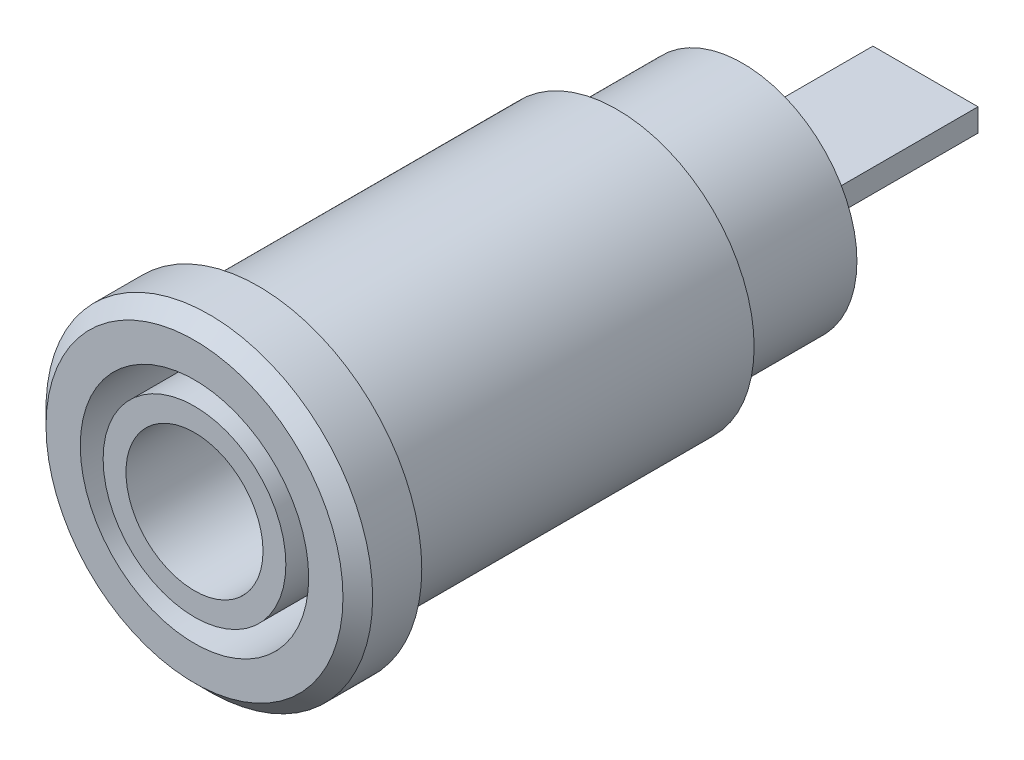
ISO-10303-21;
HEADER;
FILE_DESCRIPTION(('STEP AP214'),'2;1');
FILE_NAME('part.step','',(''),(''),'','','');
FILE_SCHEMA(('AUTOMOTIVE_DESIGN { 1 0 10303 214 1 1 1 1 }'));
ENDSEC;
DATA;
#1=APPLICATION_CONTEXT('core data for automotive mechanical design processes');
#2=APPLICATION_PROTOCOL_DEFINITION('international standard','automotive_design',2000,#1);
#3=PRODUCT_CONTEXT('',#1,'mechanical');
#4=PRODUCT('Part','Part','',(#3));
#5=PRODUCT_RELATED_PRODUCT_CATEGORY('part','',(#4));
#6=PRODUCT_DEFINITION_FORMATION('','',#4);
#7=PRODUCT_DEFINITION_CONTEXT('part definition',#1,'design');
#8=PRODUCT_DEFINITION('design','',#6,#7);
#9=PRODUCT_DEFINITION_SHAPE('','',#8);
#10=(LENGTH_UNIT() NAMED_UNIT(*) SI_UNIT(.MILLI.,.METRE.));
#11=(NAMED_UNIT(*) PLANE_ANGLE_UNIT() SI_UNIT($,.RADIAN.));
#12=(NAMED_UNIT(*) SI_UNIT($,.STERADIAN.) SOLID_ANGLE_UNIT());
#13=UNCERTAINTY_MEASURE_WITH_UNIT(LENGTH_MEASURE(1.E-05),#10,'distance_accuracy_value','');
#14=(GEOMETRIC_REPRESENTATION_CONTEXT(3) GLOBAL_UNCERTAINTY_ASSIGNED_CONTEXT((#13)) GLOBAL_UNIT_ASSIGNED_CONTEXT((#10,
#11,#12)) REPRESENTATION_CONTEXT('',''));
#15=CARTESIAN_POINT('',(0.,0.,0.));
#16=DIRECTION('',(0.,0.,1.));
#17=DIRECTION('',(1.,0.,0.));
#18=AXIS2_PLACEMENT_3D('',#15,#16,#17);
#19=CARTESIAN_POINT('',(0.,5.,-7.00000000000001));
#20=DIRECTION('',(0.,0.,1.));
#21=DIRECTION('',(1.,0.,0.));
#22=AXIS2_PLACEMENT_3D('',#19,#20,#21);
#23=PLANE('',#22);
#24=CARTESIAN_POINT('',(0.,0.,-7.00000000000001));
#25=DIRECTION('',(0.,0.,1.));
#26=DIRECTION('',(1.,0.,0.));
#27=AXIS2_PLACEMENT_3D('',#24,#25,#26);
#28=CIRCLE('',#27,5.);
#29=CARTESIAN_POINT('',(5.,0.,-7.00000000000001));
#30=VERTEX_POINT('',#29);
#31=EDGE_CURVE('E123',#30,#30,#28,.T.);
#32=ORIENTED_EDGE('',*,*,#31,.F.);
#33=EDGE_LOOP('',(#32));
#34=FACE_BOUND('',#33,.T.);
#35=DIRECTION('',(0.,1.,0.));
#36=VECTOR('',#35,1.);
#37=CARTESIAN_POINT('',(-2.3,-0.5,-7.00000000000001));
#38=LINE('',#37,#36);
#39=CARTESIAN_POINT('',(-2.3,-0.5,-7.00000000000001));
#40=VERTEX_POINT('',#39);
#41=CARTESIAN_POINT('',(-2.3,0.5,-7.00000000000001));
#42=VERTEX_POINT('',#41);
#43=EDGE_CURVE('E54',#40,#42,#38,.T.);
#44=ORIENTED_EDGE('',*,*,#43,.F.);
#45=DIRECTION('',(-1.,0.,0.));
#46=VECTOR('',#45,1.);
#47=CARTESIAN_POINT('',(2.3,-0.5,-7.00000000000001));
#48=LINE('',#47,#46);
#49=CARTESIAN_POINT('',(2.3,-0.5,-7.00000000000001));
#50=VERTEX_POINT('',#49);
#51=EDGE_CURVE('E58',#50,#40,#48,.T.);
#52=ORIENTED_EDGE('',*,*,#51,.F.);
#53=DIRECTION('',(0.,-1.,0.));
#54=VECTOR('',#53,1.);
#55=CARTESIAN_POINT('',(2.3,-0.5,-7.00000000000001));
#56=LINE('',#55,#54);
#57=CARTESIAN_POINT('',(2.3,0.5,-7.00000000000001));
#58=VERTEX_POINT('',#57);
#59=EDGE_CURVE('E373',#58,#50,#56,.T.);
#60=ORIENTED_EDGE('',*,*,#59,.F.);
#61=DIRECTION('',(1.,0.,0.));
#62=VECTOR('',#61,1.);
#63=CARTESIAN_POINT('',(2.3,0.5,-7.00000000000001));
#64=LINE('',#63,#62);
#65=EDGE_CURVE('E379',#42,#58,#64,.T.);
#66=ORIENTED_EDGE('',*,*,#65,.F.);
#67=EDGE_LOOP('',(#44,#52,#60,#66));
#68=FACE_BOUND('',#67,.T.);
#69=ADVANCED_FACE('F39',(#34,#68),#23,.F.);
#70=CARTESIAN_POINT('',(0.,5.,17.));
#71=DIRECTION('',(0.,0.,-1.));
#72=DIRECTION('',(-1.,0.,0.));
#73=AXIS2_PLACEMENT_3D('',#70,#71,#72);
#74=PLANE('',#73);
#75=CARTESIAN_POINT('',(0.,0.,17.));
#76=DIRECTION('',(0.,0.,1.));
#77=DIRECTION('',(1.,0.,0.));
#78=AXIS2_PLACEMENT_3D('',#75,#76,#77);
#79=CIRCLE('',#78,5.);
#80=CARTESIAN_POINT('',(5.,0.,17.));
#81=VERTEX_POINT('',#80);
#82=EDGE_CURVE('E100',#81,#81,#79,.T.);
#83=ORIENTED_EDGE('',*,*,#82,.F.);
#84=EDGE_LOOP('',(#83));
#85=FACE_BOUND('',#84,.T.);
#86=CARTESIAN_POINT('',(0.,0.,17.));
#87=DIRECTION('',(0.,0.,1.));
#88=DIRECTION('',(1.,0.,0.));
#89=AXIS2_PLACEMENT_3D('',#86,#87,#88);
#90=CIRCLE('',#89,6.5);
#91=CARTESIAN_POINT('',(6.5,0.,17.));
#92=VERTEX_POINT('',#91);
#93=EDGE_CURVE('E11',#92,#92,#90,.T.);
#94=ORIENTED_EDGE('',*,*,#93,.T.);
#95=EDGE_LOOP('',(#94));
#96=FACE_BOUND('',#95,.T.);
#97=ADVANCED_FACE('F41',(#85,#96),#74,.F.);
#98=CARTESIAN_POINT('',(0.,0.,16.35));
#99=DIRECTION('',(0.,0.,-1.));
#100=DIRECTION('',(-1.,0.,0.));
#101=AXIS2_PLACEMENT_3D('',#98,#99,#100);
#102=CONICAL_SURFACE('',#101,7.15,0.785398163397447);
#103=ORIENTED_EDGE('',*,*,#93,.F.);
#104=EDGE_LOOP('',(#103));
#105=FACE_BOUND('',#104,.T.);
#106=CARTESIAN_POINT('',(0.,0.,16.35));
#107=DIRECTION('',(0.,0.,1.));
#108=DIRECTION('',(1.,0.,0.));
#109=AXIS2_PLACEMENT_3D('',#106,#107,#108);
#110=CIRCLE('',#109,7.15);
#111=CARTESIAN_POINT('',(7.15,0.,16.35));
#112=VERTEX_POINT('',#111);
#113=EDGE_CURVE('E47',#112,#112,#110,.T.);
#114=ORIENTED_EDGE('',*,*,#113,.T.);
#115=EDGE_LOOP('',(#114));
#116=FACE_BOUND('',#115,.T.);
#117=ADVANCED_FACE('F140',(#105,#116),#102,.T.);
#118=CARTESIAN_POINT('',(0.,0.,0.));
#119=DIRECTION('',(0.,0.,1.));
#120=DIRECTION('',(1.,0.,0.));
#121=AXIS2_PLACEMENT_3D('',#118,#119,#120);
#122=CYLINDRICAL_SURFACE('',#121,7.15);
#123=ORIENTED_EDGE('',*,*,#113,.F.);
#124=EDGE_LOOP('',(#123));
#125=FACE_BOUND('',#124,.T.);
#126=CARTESIAN_POINT('',(0.,0.,14.2));
#127=DIRECTION('',(0.,0.,1.));
#128=DIRECTION('',(1.,0.,0.));
#129=AXIS2_PLACEMENT_3D('',#126,#127,#128);
#130=CIRCLE('',#129,7.15);
#131=CARTESIAN_POINT('',(7.15,0.,14.2));
#132=VERTEX_POINT('',#131);
#133=EDGE_CURVE('E135',#132,#132,#130,.T.);
#134=ORIENTED_EDGE('',*,*,#133,.T.);
#135=EDGE_LOOP('',(#134));
#136=FACE_BOUND('',#135,.T.);
#137=ADVANCED_FACE('F142',(#125,#136),#122,.T.);
#138=CARTESIAN_POINT('',(0.,7.15,14.2));
#139=DIRECTION('',(0.,0.,1.));
#140=DIRECTION('',(1.,0.,0.));
#141=AXIS2_PLACEMENT_3D('',#138,#139,#140);
#142=PLANE('',#141);
#143=ORIENTED_EDGE('',*,*,#133,.F.);
#144=EDGE_LOOP('',(#143));
#145=FACE_BOUND('',#144,.T.);
#146=CARTESIAN_POINT('',(0.,0.,14.2));
#147=DIRECTION('',(0.,0.,1.));
#148=DIRECTION('',(1.,0.,0.));
#149=AXIS2_PLACEMENT_3D('',#146,#147,#148);
#150=CIRCLE('',#149,6.);
#151=CARTESIAN_POINT('',(6.,0.,14.2));
#152=VERTEX_POINT('',#151);
#153=EDGE_CURVE('E132',#152,#152,#150,.T.);
#154=ORIENTED_EDGE('',*,*,#153,.T.);
#155=EDGE_LOOP('',(#154));
#156=FACE_BOUND('',#155,.T.);
#157=ADVANCED_FACE('F145',(#145,#156),#142,.F.);
#158=CARTESIAN_POINT('',(0.,0.,0.));
#159=DIRECTION('',(0.,0.,1.));
#160=DIRECTION('',(1.,0.,0.));
#161=AXIS2_PLACEMENT_3D('',#158,#159,#160);
#162=CYLINDRICAL_SURFACE('',#161,6.);
#163=ORIENTED_EDGE('',*,*,#153,.F.);
#164=EDGE_LOOP('',(#163));
#165=FACE_BOUND('',#164,.T.);
#166=CARTESIAN_POINT('',(0.,0.,-1.50000000000001));
#167=DIRECTION('',(0.,0.,1.));
#168=DIRECTION('',(1.,0.,0.));
#169=AXIS2_PLACEMENT_3D('',#166,#167,#168);
#170=CIRCLE('',#169,6.);
#171=CARTESIAN_POINT('',(6.,0.,-1.50000000000001));
#172=VERTEX_POINT('',#171);
#173=EDGE_CURVE('E129',#172,#172,#170,.T.);
#174=ORIENTED_EDGE('',*,*,#173,.T.);
#175=EDGE_LOOP('',(#174));
#176=FACE_BOUND('',#175,.T.);
#177=ADVANCED_FACE('F151',(#165,#176),#162,.T.);
#178=CARTESIAN_POINT('',(0.,0.,-2.00000000000001));
#179=DIRECTION('',(0.,0.,1.));
#180=DIRECTION('',(1.,0.,0.));
#181=AXIS2_PLACEMENT_3D('',#178,#179,#180);
#182=CONICAL_SURFACE('',#181,5.,1.10714871779409);
#183=ORIENTED_EDGE('',*,*,#173,.F.);
#184=EDGE_LOOP('',(#183));
#185=FACE_BOUND('',#184,.T.);
#186=CARTESIAN_POINT('',(0.,0.,-2.00000000000001));
#187=DIRECTION('',(0.,0.,1.));
#188=DIRECTION('',(1.,0.,0.));
#189=AXIS2_PLACEMENT_3D('',#186,#187,#188);
#190=CIRCLE('',#189,5.);
#191=CARTESIAN_POINT('',(5.,0.,-2.00000000000001));
#192=VERTEX_POINT('',#191);
#193=EDGE_CURVE('E126',#192,#192,#190,.T.);
#194=ORIENTED_EDGE('',*,*,#193,.T.);
#195=EDGE_LOOP('',(#194));
#196=FACE_BOUND('',#195,.T.);
#197=ADVANCED_FACE('F157',(#185,#196),#182,.T.);
#198=CARTESIAN_POINT('',(0.,0.,0.));
#199=DIRECTION('',(0.,0.,1.));
#200=DIRECTION('',(1.,0.,0.));
#201=AXIS2_PLACEMENT_3D('',#198,#199,#200);
#202=CYLINDRICAL_SURFACE('',#201,5.);
#203=ORIENTED_EDGE('',*,*,#193,.F.);
#204=EDGE_LOOP('',(#203));
#205=FACE_BOUND('',#204,.T.);
#206=ORIENTED_EDGE('',*,*,#31,.T.);
#207=EDGE_LOOP('',(#206));
#208=FACE_BOUND('',#207,.T.);
#209=ADVANCED_FACE('F163',(#205,#208),#202,.T.);
#210=CARTESIAN_POINT('',(0.,3.,0.));
#211=DIRECTION('',(0.,0.,-1.));
#212=DIRECTION('',(-1.,0.,0.));
#213=AXIS2_PLACEMENT_3D('',#210,#211,#212);
#214=PLANE('',#213);
#215=CARTESIAN_POINT('',(0.,0.,0.));
#216=DIRECTION('',(0.,0.,1.));
#217=DIRECTION('',(1.,0.,0.));
#218=AXIS2_PLACEMENT_3D('',#215,#216,#217);
#219=CIRCLE('',#218,3.);
#220=CARTESIAN_POINT('',(3.,0.,0.));
#221=VERTEX_POINT('',#220);
#222=EDGE_CURVE('E120',#221,#221,#219,.T.);
#223=ORIENTED_EDGE('',*,*,#222,.T.);
#224=EDGE_LOOP('',(#223));
#225=FACE_BOUND('',#224,.T.);
#226=ADVANCED_FACE('F169',(#225),#214,.F.);
#227=CARTESIAN_POINT('',(0.,0.,0.));
#228=DIRECTION('',(0.,0.,1.));
#229=DIRECTION('',(1.,0.,0.));
#230=AXIS2_PLACEMENT_3D('',#227,#228,#229);
#231=CYLINDRICAL_SURFACE('',#230,3.);
#232=ORIENTED_EDGE('',*,*,#222,.F.);
#233=EDGE_LOOP('',(#232));
#234=FACE_BOUND('',#233,.T.);
#235=CARTESIAN_POINT('',(0.,0.,17.));
#236=DIRECTION('',(0.,0.,1.));
#237=DIRECTION('',(1.,0.,0.));
#238=AXIS2_PLACEMENT_3D('',#235,#236,#237);
#239=CIRCLE('',#238,3.);
#240=CARTESIAN_POINT('',(3.,0.,17.));
#241=VERTEX_POINT('',#240);
#242=EDGE_CURVE('E117',#241,#241,#239,.T.);
#243=ORIENTED_EDGE('',*,*,#242,.T.);
#244=EDGE_LOOP('',(#243));
#245=FACE_BOUND('',#244,.T.);
#246=ADVANCED_FACE('F215',(#234,#245),#231,.F.);
#247=CARTESIAN_POINT('',(0.,4.,17.));
#248=DIRECTION('',(0.,0.,-1.));
#249=DIRECTION('',(-1.,0.,0.));
#250=AXIS2_PLACEMENT_3D('',#247,#248,#249);
#251=PLANE('',#250);
#252=ORIENTED_EDGE('',*,*,#242,.F.);
#253=EDGE_LOOP('',(#252));
#254=FACE_BOUND('',#253,.T.);
#255=CARTESIAN_POINT('',(0.,0.,17.));
#256=DIRECTION('',(0.,0.,1.));
#257=DIRECTION('',(1.,0.,0.));
#258=AXIS2_PLACEMENT_3D('',#255,#256,#257);
#259=CIRCLE('',#258,4.);
#260=CARTESIAN_POINT('',(4.,0.,17.));
#261=VERTEX_POINT('',#260);
#262=EDGE_CURVE('E114',#261,#261,#259,.T.);
#263=ORIENTED_EDGE('',*,*,#262,.T.);
#264=EDGE_LOOP('',(#263));
#265=FACE_BOUND('',#264,.T.);
#266=ADVANCED_FACE('F222',(#254,#265),#251,.F.);
#267=CARTESIAN_POINT('',(0.,0.,0.));
#268=DIRECTION('',(0.,0.,1.));
#269=DIRECTION('',(1.,0.,0.));
#270=AXIS2_PLACEMENT_3D('',#267,#268,#269);
#271=CYLINDRICAL_SURFACE('',#270,4.);
#272=ORIENTED_EDGE('',*,*,#262,.F.);
#273=EDGE_LOOP('',(#272));
#274=FACE_BOUND('',#273,.T.);
#275=CARTESIAN_POINT('',(0.,0.,0.));
#276=DIRECTION('',(0.,0.,1.));
#277=DIRECTION('',(1.,0.,0.));
#278=AXIS2_PLACEMENT_3D('',#275,#276,#277);
#279=CIRCLE('',#278,4.);
#280=CARTESIAN_POINT('',(4.,0.,0.));
#281=VERTEX_POINT('',#280);
#282=EDGE_CURVE('E111',#281,#281,#279,.T.);
#283=ORIENTED_EDGE('',*,*,#282,.T.);
#284=EDGE_LOOP('',(#283));
#285=FACE_BOUND('',#284,.T.);
#286=ADVANCED_FACE('F229',(#274,#285),#271,.T.);
#287=CARTESIAN_POINT('',(0.,5.,0.));
#288=DIRECTION('',(0.,0.,-1.));
#289=DIRECTION('',(-1.,0.,0.));
#290=AXIS2_PLACEMENT_3D('',#287,#288,#289);
#291=PLANE('',#290);
#292=ORIENTED_EDGE('',*,*,#282,.F.);
#293=EDGE_LOOP('',(#292));
#294=FACE_BOUND('',#293,.T.);
#295=CARTESIAN_POINT('',(0.,0.,0.));
#296=DIRECTION('',(0.,0.,1.));
#297=DIRECTION('',(1.,0.,0.));
#298=AXIS2_PLACEMENT_3D('',#295,#296,#297);
#299=CIRCLE('',#298,5.);
#300=CARTESIAN_POINT('',(5.,0.,0.));
#301=VERTEX_POINT('',#300);
#302=EDGE_CURVE('E103',#301,#301,#299,.T.);
#303=ORIENTED_EDGE('',*,*,#302,.T.);
#304=EDGE_LOOP('',(#303));
#305=FACE_BOUND('',#304,.T.);
#306=ADVANCED_FACE('F237',(#294,#305),#291,.F.);
#307=CARTESIAN_POINT('',(0.,0.,0.));
#308=DIRECTION('',(0.,0.,1.));
#309=DIRECTION('',(1.,0.,0.));
#310=AXIS2_PLACEMENT_3D('',#307,#308,#309);
#311=CYLINDRICAL_SURFACE('',#310,5.);
#312=ORIENTED_EDGE('',*,*,#302,.F.);
#313=EDGE_LOOP('',(#312));
#314=FACE_BOUND('',#313,.T.);
#315=ORIENTED_EDGE('',*,*,#82,.T.);
#316=EDGE_LOOP('',(#315));
#317=FACE_BOUND('',#316,.T.);
#318=ADVANCED_FACE('F245',(#314,#317),#311,.F.);
#319=CARTESIAN_POINT('',(-2.3,-0.5,-15.));
#320=DIRECTION('',(1.,0.,0.));
#321=DIRECTION('',(0.,0.,-1.));
#322=AXIS2_PLACEMENT_3D('',#319,#320,#321);
#323=PLANE('',#322);
#324=ORIENTED_EDGE('',*,*,#43,.T.);
#325=DIRECTION('',(0.,0.,1.));
#326=VECTOR('',#325,1.);
#327=CARTESIAN_POINT('',(-2.3,0.5,-15.));
#328=LINE('',#327,#326);
#329=CARTESIAN_POINT('',(-2.3,0.5,-15.));
#330=VERTEX_POINT('',#329);
#331=EDGE_CURVE('E83',#330,#42,#328,.T.);
#332=ORIENTED_EDGE('',*,*,#331,.F.);
#333=DIRECTION('',(0.,1.,0.));
#334=VECTOR('',#333,1.);
#335=CARTESIAN_POINT('',(-2.3,-0.5,-15.));
#336=LINE('',#335,#334);
#337=CARTESIAN_POINT('',(-2.3,-0.5,-15.));
#338=VERTEX_POINT('',#337);
#339=EDGE_CURVE('E89',#338,#330,#336,.T.);
#340=ORIENTED_EDGE('',*,*,#339,.F.);
#341=DIRECTION('',(0.,0.,1.));
#342=VECTOR('',#341,1.);
#343=CARTESIAN_POINT('',(-2.3,-0.5,-15.));
#344=LINE('',#343,#342);
#345=EDGE_CURVE('E371',#338,#40,#344,.T.);
#346=ORIENTED_EDGE('',*,*,#345,.T.);
#347=EDGE_LOOP('',(#324,#332,#340,#346));
#348=FACE_BOUND('',#347,.T.);
#349=ADVANCED_FACE('F99',(#348),#323,.F.);
#350=CARTESIAN_POINT('',(2.3,0.5,-15.));
#351=DIRECTION('',(0.,-1.,0.));
#352=DIRECTION('',(0.,0.,-1.));
#353=AXIS2_PLACEMENT_3D('',#350,#351,#352);
#354=PLANE('',#353);
#355=ORIENTED_EDGE('',*,*,#65,.T.);
#356=DIRECTION('',(0.,0.,1.));
#357=VECTOR('',#356,1.);
#358=CARTESIAN_POINT('',(2.3,0.5,-15.));
#359=LINE('',#358,#357);
#360=CARTESIAN_POINT('',(2.3,0.5,-15.));
#361=VERTEX_POINT('',#360);
#362=EDGE_CURVE('E85',#361,#58,#359,.T.);
#363=ORIENTED_EDGE('',*,*,#362,.F.);
#364=DIRECTION('',(1.,0.,0.));
#365=VECTOR('',#364,1.);
#366=CARTESIAN_POINT('',(2.3,0.5,-15.));
#367=LINE('',#366,#365);
#368=EDGE_CURVE('E78',#330,#361,#367,.T.);
#369=ORIENTED_EDGE('',*,*,#368,.F.);
#370=ORIENTED_EDGE('',*,*,#331,.T.);
#371=EDGE_LOOP('',(#355,#363,#369,#370));
#372=FACE_BOUND('',#371,.T.);
#373=ADVANCED_FACE('F81',(#372),#354,.F.);
#374=CARTESIAN_POINT('',(2.3,-0.5,-15.));
#375=DIRECTION('',(-1.,0.,0.));
#376=DIRECTION('',(0.,0.,1.));
#377=AXIS2_PLACEMENT_3D('',#374,#375,#376);
#378=PLANE('',#377);
#379=ORIENTED_EDGE('',*,*,#59,.T.);
#380=DIRECTION('',(0.,0.,1.));
#381=VECTOR('',#380,1.);
#382=CARTESIAN_POINT('',(2.3,-0.5,-15.));
#383=LINE('',#382,#381);
#384=CARTESIAN_POINT('',(2.3,-0.5,-15.));
#385=VERTEX_POINT('',#384);
#386=EDGE_CURVE('E105',#385,#50,#383,.T.);
#387=ORIENTED_EDGE('',*,*,#386,.F.);
#388=DIRECTION('',(0.,-1.,0.));
#389=VECTOR('',#388,1.);
#390=CARTESIAN_POINT('',(2.3,-0.5,-15.));
#391=LINE('',#390,#389);
#392=EDGE_CURVE('E88',#361,#385,#391,.T.);
#393=ORIENTED_EDGE('',*,*,#392,.F.);
#394=ORIENTED_EDGE('',*,*,#362,.T.);
#395=EDGE_LOOP('',(#379,#387,#393,#394));
#396=FACE_BOUND('',#395,.T.);
#397=ADVANCED_FACE('F266',(#396),#378,.F.);
#398=CARTESIAN_POINT('',(2.3,-0.5,-15.));
#399=DIRECTION('',(0.,1.,0.));
#400=DIRECTION('',(0.,0.,1.));
#401=AXIS2_PLACEMENT_3D('',#398,#399,#400);
#402=PLANE('',#401);
#403=ORIENTED_EDGE('',*,*,#51,.T.);
#404=ORIENTED_EDGE('',*,*,#345,.F.);
#405=DIRECTION('',(-1.,0.,0.));
#406=VECTOR('',#405,1.);
#407=CARTESIAN_POINT('',(2.3,-0.5,-15.));
#408=LINE('',#407,#406);
#409=EDGE_CURVE('E94',#385,#338,#408,.T.);
#410=ORIENTED_EDGE('',*,*,#409,.F.);
#411=ORIENTED_EDGE('',*,*,#386,.T.);
#412=EDGE_LOOP('',(#403,#404,#410,#411));
#413=FACE_BOUND('',#412,.T.);
#414=ADVANCED_FACE('F273',(#413),#402,.F.);
#415=CARTESIAN_POINT('',(0.,0.,-15.));
#416=DIRECTION('',(0.,0.,1.));
#417=DIRECTION('',(1.,0.,0.));
#418=AXIS2_PLACEMENT_3D('',#415,#416,#417);
#419=PLANE('',#418);
#420=ORIENTED_EDGE('',*,*,#339,.T.);
#421=ORIENTED_EDGE('',*,*,#368,.T.);
#422=ORIENTED_EDGE('',*,*,#392,.T.);
#423=ORIENTED_EDGE('',*,*,#409,.T.);
#424=EDGE_LOOP('',(#420,#421,#422,#423));
#425=FACE_BOUND('',#424,.T.);
#426=ADVANCED_FACE('F92',(#425),#419,.F.);
#427=CLOSED_SHELL('',(#69,#97,#117,#137,#157,#177,#197,#209,#226,#246,#266,#286,#306,#318,#349,
#373,#397,#414,#426));
#428=MANIFOLD_SOLID_BREP('B2',#427);
#429=ADVANCED_BREP_SHAPE_REPRESENTATION('',(#18,#428),#14);
#430=SHAPE_DEFINITION_REPRESENTATION(#9,#429);
ENDSEC;
END-ISO-10303-21;
